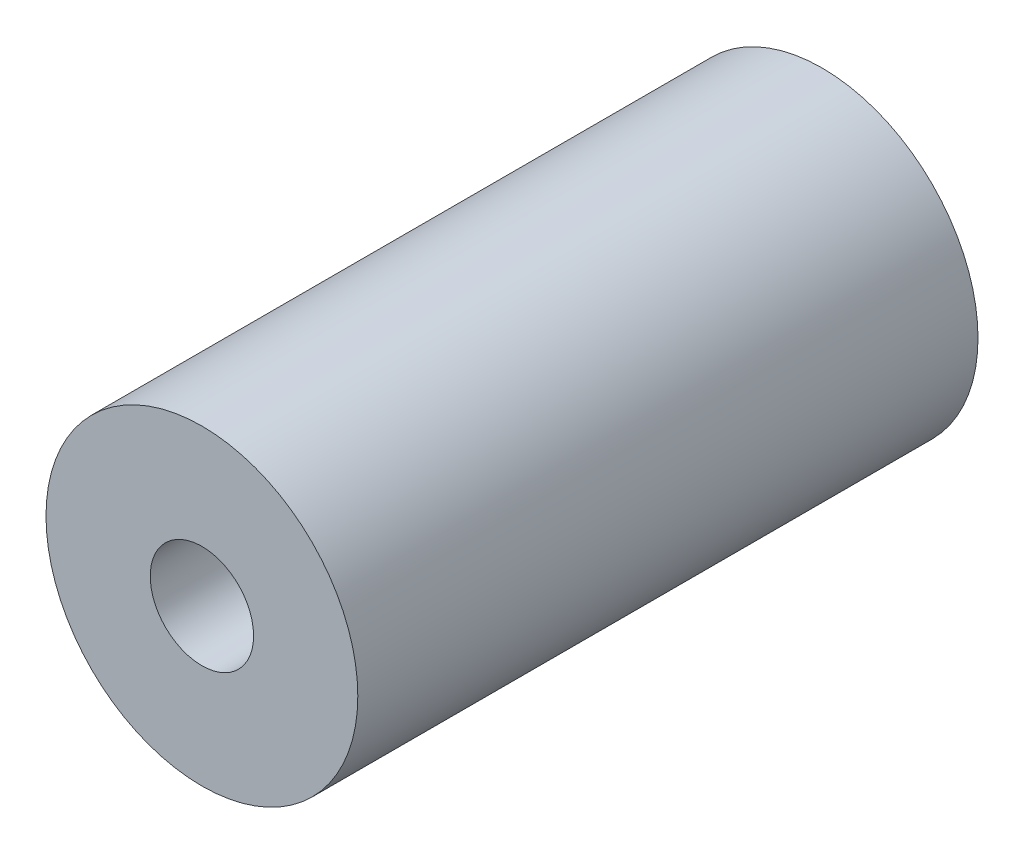
ISO-10303-21;
HEADER;
FILE_DESCRIPTION(('STEP AP214'),'2;1');
FILE_NAME('part.step','',(''),(''),'','','');
FILE_SCHEMA(('AUTOMOTIVE_DESIGN { 1 0 10303 214 1 1 1 1 }'));
ENDSEC;
DATA;
#1=APPLICATION_CONTEXT('core data for automotive mechanical design processes');
#2=APPLICATION_PROTOCOL_DEFINITION('international standard','automotive_design',2000,#1);
#3=PRODUCT_CONTEXT('',#1,'mechanical');
#4=PRODUCT('Part','Part','',(#3));
#5=PRODUCT_RELATED_PRODUCT_CATEGORY('part','',(#4));
#6=PRODUCT_DEFINITION_FORMATION('','',#4);
#7=PRODUCT_DEFINITION_CONTEXT('part definition',#1,'design');
#8=PRODUCT_DEFINITION('design','',#6,#7);
#9=PRODUCT_DEFINITION_SHAPE('','',#8);
#10=(LENGTH_UNIT() NAMED_UNIT(*) SI_UNIT(.MILLI.,.METRE.));
#11=(NAMED_UNIT(*) PLANE_ANGLE_UNIT() SI_UNIT($,.RADIAN.));
#12=(NAMED_UNIT(*) SI_UNIT($,.STERADIAN.) SOLID_ANGLE_UNIT());
#13=UNCERTAINTY_MEASURE_WITH_UNIT(LENGTH_MEASURE(1.E-05),#10,'distance_accuracy_value','');
#14=(GEOMETRIC_REPRESENTATION_CONTEXT(3) GLOBAL_UNCERTAINTY_ASSIGNED_CONTEXT((#13)) GLOBAL_UNIT_ASSIGNED_CONTEXT((#10,
#11,#12)) REPRESENTATION_CONTEXT('',''));
#15=CARTESIAN_POINT('',(0.,0.,0.));
#16=DIRECTION('',(0.,0.,1.));
#17=DIRECTION('',(1.,0.,0.));
#18=AXIS2_PLACEMENT_3D('',#15,#16,#17);
#19=CARTESIAN_POINT('',(-63.5941440364663,24.9570042003574,18.));
#20=DIRECTION('',(0.,0.,-1.));
#21=DIRECTION('',(-1.,0.,0.));
#22=AXIS2_PLACEMENT_3D('',#19,#20,#21);
#23=CYLINDRICAL_SURFACE('',#22,4.525);
#24=CARTESIAN_POINT('',(-63.5941440364663,24.9570042003574,18.));
#25=DIRECTION('',(0.,0.,1.));
#26=DIRECTION('',(1.,0.,0.));
#27=AXIS2_PLACEMENT_3D('',#24,#25,#26);
#28=CIRCLE('',#27,4.525);
#29=CARTESIAN_POINT('',(-59.0691440364663,24.9570042003574,18.));
#30=VERTEX_POINT('',#29);
#31=EDGE_CURVE('E10',#30,#30,#28,.T.);
#32=ORIENTED_EDGE('',*,*,#31,.F.);
#33=EDGE_LOOP('',(#32));
#34=FACE_BOUND('',#33,.T.);
#35=CARTESIAN_POINT('',(-63.5941440364663,24.9570042003574,0.));
#36=DIRECTION('',(0.,0.,1.));
#37=DIRECTION('',(1.,0.,0.));
#38=AXIS2_PLACEMENT_3D('',#35,#36,#37);
#39=CIRCLE('',#38,4.525);
#40=CARTESIAN_POINT('',(-59.0691440364663,24.9570042003574,0.));
#41=VERTEX_POINT('',#40);
#42=EDGE_CURVE('E38',#41,#41,#39,.T.);
#43=ORIENTED_EDGE('',*,*,#42,.T.);
#44=EDGE_LOOP('',(#43));
#45=FACE_BOUND('',#44,.T.);
#46=ADVANCED_FACE('F35',(#34,#45),#23,.T.);
#47=CARTESIAN_POINT('',(-63.5941440364663,24.9570042003574,18.));
#48=DIRECTION('',(0.,0.,1.));
#49=DIRECTION('',(1.,0.,0.));
#50=AXIS2_PLACEMENT_3D('',#47,#48,#49);
#51=PLANE('',#50);
#52=CARTESIAN_POINT('',(-63.5941440364663,24.9570042003574,18.));
#53=DIRECTION('',(0.,0.,1.));
#54=DIRECTION('',(1.,0.,0.));
#55=AXIS2_PLACEMENT_3D('',#52,#53,#54);
#56=CIRCLE('',#55,1.5);
#57=CARTESIAN_POINT('',(-62.0941440364663,24.9570042003574,18.));
#58=VERTEX_POINT('',#57);
#59=EDGE_CURVE('E47',#58,#58,#56,.T.);
#60=ORIENTED_EDGE('',*,*,#59,.F.);
#61=EDGE_LOOP('',(#60));
#62=FACE_BOUND('',#61,.T.);
#63=ORIENTED_EDGE('',*,*,#31,.T.);
#64=EDGE_LOOP('',(#63));
#65=FACE_BOUND('',#64,.T.);
#66=ADVANCED_FACE('F62',(#62,#65),#51,.T.);
#67=CARTESIAN_POINT('',(-63.5941440364663,24.9570042003574,0.));
#68=DIRECTION('',(0.,0.,1.));
#69=DIRECTION('',(1.,0.,0.));
#70=AXIS2_PLACEMENT_3D('',#67,#68,#69);
#71=PLANE('',#70);
#72=CARTESIAN_POINT('',(-63.5941440364663,24.9570042003574,0.));
#73=DIRECTION('',(0.,0.,1.));
#74=DIRECTION('',(1.,0.,0.));
#75=AXIS2_PLACEMENT_3D('',#72,#73,#74);
#76=CIRCLE('',#75,1.5);
#77=CARTESIAN_POINT('',(-62.0941440364663,24.9570042003574,0.));
#78=VERTEX_POINT('',#77);
#79=EDGE_CURVE('E45',#78,#78,#76,.T.);
#80=ORIENTED_EDGE('',*,*,#79,.T.);
#81=EDGE_LOOP('',(#80));
#82=FACE_BOUND('',#81,.T.);
#83=ORIENTED_EDGE('',*,*,#42,.F.);
#84=EDGE_LOOP('',(#83));
#85=FACE_BOUND('',#84,.T.);
#86=ADVANCED_FACE('F53',(#82,#85),#71,.F.);
#87=CARTESIAN_POINT('',(-63.5941440364663,24.9570042003574,0.));
#88=DIRECTION('',(0.,0.,1.));
#89=DIRECTION('',(1.,0.,0.));
#90=AXIS2_PLACEMENT_3D('',#87,#88,#89);
#91=CYLINDRICAL_SURFACE('',#90,1.5);
#92=ORIENTED_EDGE('',*,*,#79,.F.);
#93=EDGE_LOOP('',(#92));
#94=FACE_BOUND('',#93,.T.);
#95=ORIENTED_EDGE('',*,*,#59,.T.);
#96=EDGE_LOOP('',(#95));
#97=FACE_BOUND('',#96,.T.);
#98=ADVANCED_FACE('F56',(#94,#97),#91,.F.);
#99=CLOSED_SHELL('',(#46,#66,#86,#98));
#100=MANIFOLD_SOLID_BREP('B2',#99);
#101=ADVANCED_BREP_SHAPE_REPRESENTATION('',(#18,#100),#14);
#102=SHAPE_DEFINITION_REPRESENTATION(#9,#101);
ENDSEC;
END-ISO-10303-21;
